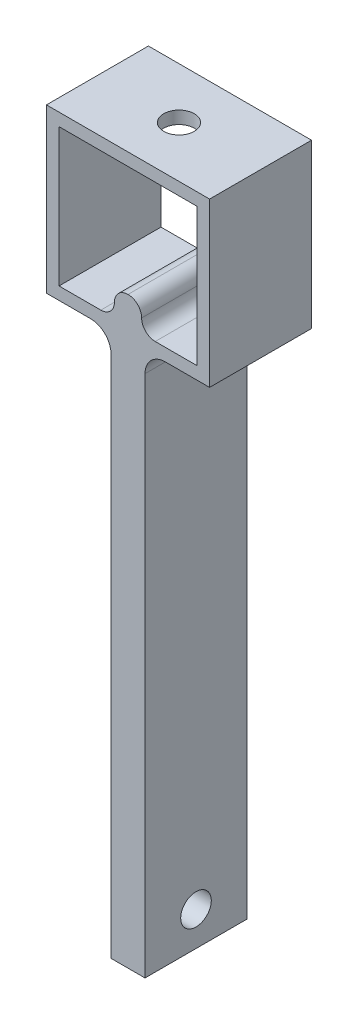
ISO-10303-21;
HEADER;
FILE_DESCRIPTION(('STEP AP214'),'2;1');
FILE_NAME('part.step','',(''),(''),'','','');
FILE_SCHEMA(('AUTOMOTIVE_DESIGN { 1 0 10303 214 1 1 1 1 }'));
ENDSEC;
DATA;
#1=APPLICATION_CONTEXT('core data for automotive mechanical design processes');
#2=APPLICATION_PROTOCOL_DEFINITION('international standard','automotive_design',2000,#1);
#3=PRODUCT_CONTEXT('',#1,'mechanical');
#4=PRODUCT('Part','Part','',(#3));
#5=PRODUCT_RELATED_PRODUCT_CATEGORY('part','',(#4));
#6=PRODUCT_DEFINITION_FORMATION('','',#4);
#7=PRODUCT_DEFINITION_CONTEXT('part definition',#1,'design');
#8=PRODUCT_DEFINITION('design','',#6,#7);
#9=PRODUCT_DEFINITION_SHAPE('','',#8);
#10=(LENGTH_UNIT() NAMED_UNIT(*) SI_UNIT(.MILLI.,.METRE.));
#11=(NAMED_UNIT(*) PLANE_ANGLE_UNIT() SI_UNIT($,.RADIAN.));
#12=(NAMED_UNIT(*) SI_UNIT($,.STERADIAN.) SOLID_ANGLE_UNIT());
#13=UNCERTAINTY_MEASURE_WITH_UNIT(LENGTH_MEASURE(1.E-05),#10,'distance_accuracy_value','');
#14=(GEOMETRIC_REPRESENTATION_CONTEXT(3) GLOBAL_UNCERTAINTY_ASSIGNED_CONTEXT((#13)) GLOBAL_UNIT_ASSIGNED_CONTEXT((#10,
#11,#12)) REPRESENTATION_CONTEXT('',''));
#15=CARTESIAN_POINT('',(0.,0.,0.));
#16=DIRECTION('',(0.,0.,1.));
#17=DIRECTION('',(1.,0.,0.));
#18=AXIS2_PLACEMENT_3D('',#15,#16,#17);
#19=CARTESIAN_POINT('',(10.15,-10.15,20.));
#20=DIRECTION('',(0.,-1.,0.));
#21=DIRECTION('',(0.,0.,-1.));
#22=AXIS2_PLACEMENT_3D('',#19,#20,#21);
#23=PLANE('',#22);
#24=DIRECTION('',(-1.,0.,0.));
#25=VECTOR('',#24,1.);
#26=CARTESIAN_POINT('',(10.15,-10.15,0.));
#27=LINE('',#26,#25);
#28=CARTESIAN_POINT('',(10.15,-10.15,0.));
#29=VERTEX_POINT('',#28);
#30=CARTESIAN_POINT('',(4.,-10.15,0.));
#31=VERTEX_POINT('',#30);
#32=EDGE_CURVE('E208',#29,#31,#27,.T.);
#33=ORIENTED_EDGE('',*,*,#32,.T.);
#34=DIRECTION('',(0.,0.,1.));
#35=VECTOR('',#34,1.);
#36=CARTESIAN_POINT('',(4.,-10.15,20.));
#37=LINE('',#36,#35);
#38=CARTESIAN_POINT('',(4.,-10.15,15.));
#39=VERTEX_POINT('',#38);
#40=EDGE_CURVE('E269',#31,#39,#37,.T.);
#41=ORIENTED_EDGE('',*,*,#40,.T.);
#42=DIRECTION('',(-1.,0.,0.));
#43=VECTOR('',#42,1.);
#44=CARTESIAN_POINT('',(0.,-10.15,15.));
#45=LINE('',#44,#43);
#46=CARTESIAN_POINT('',(10.15,-10.15,15.));
#47=VERTEX_POINT('',#46);
#48=EDGE_CURVE('E228',#47,#39,#45,.T.);
#49=ORIENTED_EDGE('',*,*,#48,.F.);
#50=DIRECTION('',(0.,0.,-1.));
#51=VECTOR('',#50,1.);
#52=CARTESIAN_POINT('',(10.15,-10.15,20.));
#53=LINE('',#52,#51);
#54=EDGE_CURVE('E216',#47,#29,#53,.T.);
#55=ORIENTED_EDGE('',*,*,#54,.T.);
#56=EDGE_LOOP('',(#33,#41,#49,#55));
#57=FACE_BOUND('',#56,.T.);
#58=ADVANCED_FACE('F33',(#57),#23,.F.);
#59=CARTESIAN_POINT('',(-12.,-12.,15.));
#60=DIRECTION('',(0.,1.,0.));
#61=DIRECTION('',(0.,0.,1.));
#62=AXIS2_PLACEMENT_3D('',#59,#60,#61);
#63=PLANE('',#62);
#64=DIRECTION('',(1.,0.,0.));
#65=VECTOR('',#64,1.);
#66=CARTESIAN_POINT('',(-12.,-12.,0.));
#67=LINE('',#66,#65);
#68=CARTESIAN_POINT('',(-12.,-12.,0.));
#69=VERTEX_POINT('',#68);
#70=CARTESIAN_POINT('',(-5.5,-12.,0.));
#71=VERTEX_POINT('',#70);
#72=EDGE_CURVE('E239',#69,#71,#67,.T.);
#73=ORIENTED_EDGE('',*,*,#72,.T.);
#74=DIRECTION('',(0.,0.,-1.));
#75=VECTOR('',#74,1.);
#76=CARTESIAN_POINT('',(-5.5,-12.,15.));
#77=LINE('',#76,#75);
#78=CARTESIAN_POINT('',(-5.5,-12.,15.));
#79=VERTEX_POINT('',#78);
#80=EDGE_CURVE('E54',#71,#79,#77,.F.);
#81=ORIENTED_EDGE('',*,*,#80,.T.);
#82=DIRECTION('',(1.,0.,0.));
#83=VECTOR('',#82,1.);
#84=CARTESIAN_POINT('',(-12.,-12.,15.));
#85=LINE('',#84,#83);
#86=CARTESIAN_POINT('',(-12.,-12.,15.));
#87=VERTEX_POINT('',#86);
#88=EDGE_CURVE('E244',#87,#79,#85,.T.);
#89=ORIENTED_EDGE('',*,*,#88,.F.);
#90=DIRECTION('',(0.,0.,-1.));
#91=VECTOR('',#90,1.);
#92=CARTESIAN_POINT('',(-12.,-12.,15.));
#93=LINE('',#92,#91);
#94=EDGE_CURVE('E257',#87,#69,#93,.T.);
#95=ORIENTED_EDGE('',*,*,#94,.T.);
#96=EDGE_LOOP('',(#73,#81,#89,#95));
#97=FACE_BOUND('',#96,.T.);
#98=ADVANCED_FACE('F334',(#97),#63,.F.);
#99=CARTESIAN_POINT('',(5.5,-12.,15.));
#100=VERTEX_POINT('',#99);
#101=CARTESIAN_POINT('',(12.,-12.,15.));
#102=VERTEX_POINT('',#101);
#103=EDGE_CURVE('E243',#100,#102,#85,.T.);
#104=ORIENTED_EDGE('',*,*,#103,.F.);
#105=DIRECTION('',(0.,0.,1.));
#106=VECTOR('',#105,1.);
#107=CARTESIAN_POINT('',(5.5,-12.,0.));
#108=LINE('',#107,#106);
#109=CARTESIAN_POINT('',(5.5,-12.,0.));
#110=VERTEX_POINT('',#109);
#111=EDGE_CURVE('E299',#100,#110,#108,.F.);
#112=ORIENTED_EDGE('',*,*,#111,.T.);
#113=CARTESIAN_POINT('',(12.,-12.,0.));
#114=VERTEX_POINT('',#113);
#115=EDGE_CURVE('E253',#110,#114,#67,.T.);
#116=ORIENTED_EDGE('',*,*,#115,.T.);
#117=DIRECTION('',(0.,0.,-1.));
#118=VECTOR('',#117,1.);
#119=CARTESIAN_POINT('',(12.,-12.,15.));
#120=LINE('',#119,#118);
#121=EDGE_CURVE('E246',#102,#114,#120,.T.);
#122=ORIENTED_EDGE('',*,*,#121,.F.);
#123=EDGE_LOOP('',(#104,#112,#116,#122));
#124=FACE_BOUND('',#123,.T.);
#125=ADVANCED_FACE('F321',(#124),#63,.F.);
#126=CARTESIAN_POINT('',(12.,-12.,15.));
#127=DIRECTION('',(-1.,0.,0.));
#128=DIRECTION('',(0.,0.,1.));
#129=AXIS2_PLACEMENT_3D('',#126,#127,#128);
#130=PLANE('',#129);
#131=DIRECTION('',(0.,1.,0.));
#132=VECTOR('',#131,1.);
#133=CARTESIAN_POINT('',(12.,-12.,0.));
#134=LINE('',#133,#132);
#135=CARTESIAN_POINT('',(12.,12.,0.));
#136=VERTEX_POINT('',#135);
#137=EDGE_CURVE('E234',#114,#136,#134,.T.);
#138=ORIENTED_EDGE('',*,*,#137,.T.);
#139=DIRECTION('',(0.,0.,-1.));
#140=VECTOR('',#139,1.);
#141=CARTESIAN_POINT('',(12.,12.,15.));
#142=LINE('',#141,#140);
#143=CARTESIAN_POINT('',(12.,12.,15.));
#144=VERTEX_POINT('',#143);
#145=EDGE_CURVE('E263',#144,#136,#142,.T.);
#146=ORIENTED_EDGE('',*,*,#145,.F.);
#147=DIRECTION('',(0.,1.,0.));
#148=VECTOR('',#147,1.);
#149=CARTESIAN_POINT('',(12.,-12.,15.));
#150=LINE('',#149,#148);
#151=EDGE_CURVE('E235',#102,#144,#150,.T.);
#152=ORIENTED_EDGE('',*,*,#151,.F.);
#153=ORIENTED_EDGE('',*,*,#121,.T.);
#154=EDGE_LOOP('',(#138,#146,#152,#153));
#155=FACE_BOUND('',#154,.T.);
#156=ADVANCED_FACE('F325',(#155),#130,.F.);
#157=CARTESIAN_POINT('',(-12.,12.,15.));
#158=DIRECTION('',(0.,-1.,0.));
#159=DIRECTION('',(0.,0.,-1.));
#160=AXIS2_PLACEMENT_3D('',#157,#158,#159);
#161=PLANE('',#160);
#162=CARTESIAN_POINT('',(0.,12.,7.5));
#163=DIRECTION('',(0.,1.,0.));
#164=DIRECTION('',(0.,0.,1.));
#165=AXIS2_PLACEMENT_3D('',#162,#163,#164);
#166=CIRCLE('',#165,2.25);
#167=CARTESIAN_POINT('',(0.,12.,9.75));
#168=VERTEX_POINT('',#167);
#169=EDGE_CURVE('E191',#168,#168,#166,.T.);
#170=ORIENTED_EDGE('',*,*,#169,.F.);
#171=EDGE_LOOP('',(#170));
#172=FACE_BOUND('',#171,.T.);
#173=DIRECTION('',(-1.,0.,0.));
#174=VECTOR('',#173,1.);
#175=CARTESIAN_POINT('',(-12.,12.,0.));
#176=LINE('',#175,#174);
#177=CARTESIAN_POINT('',(-12.,12.,0.));
#178=VERTEX_POINT('',#177);
#179=EDGE_CURVE('E249',#136,#178,#176,.T.);
#180=ORIENTED_EDGE('',*,*,#179,.T.);
#181=DIRECTION('',(0.,0.,-1.));
#182=VECTOR('',#181,1.);
#183=CARTESIAN_POINT('',(-12.,12.,15.));
#184=LINE('',#183,#182);
#185=CARTESIAN_POINT('',(-12.,12.,15.));
#186=VERTEX_POINT('',#185);
#187=EDGE_CURVE('E260',#186,#178,#184,.T.);
#188=ORIENTED_EDGE('',*,*,#187,.F.);
#189=DIRECTION('',(-1.,0.,0.));
#190=VECTOR('',#189,1.);
#191=CARTESIAN_POINT('',(-12.,12.,15.));
#192=LINE('',#191,#190);
#193=EDGE_CURVE('E238',#144,#186,#192,.T.);
#194=ORIENTED_EDGE('',*,*,#193,.F.);
#195=ORIENTED_EDGE('',*,*,#145,.T.);
#196=EDGE_LOOP('',(#180,#188,#194,#195));
#197=FACE_BOUND('',#196,.T.);
#198=ADVANCED_FACE('F330',(#172,#197),#161,.F.);
#199=CARTESIAN_POINT('',(-12.,-12.,15.));
#200=DIRECTION('',(1.,0.,0.));
#201=DIRECTION('',(0.,0.,-1.));
#202=AXIS2_PLACEMENT_3D('',#199,#200,#201);
#203=PLANE('',#202);
#204=DIRECTION('',(0.,-1.,0.));
#205=VECTOR('',#204,1.);
#206=CARTESIAN_POINT('',(-12.,-12.,0.));
#207=LINE('',#206,#205);
#208=EDGE_CURVE('E251',#178,#69,#207,.T.);
#209=ORIENTED_EDGE('',*,*,#208,.T.);
#210=ORIENTED_EDGE('',*,*,#94,.F.);
#211=DIRECTION('',(0.,-1.,0.));
#212=VECTOR('',#211,1.);
#213=CARTESIAN_POINT('',(-12.,-12.,15.));
#214=LINE('',#213,#212);
#215=EDGE_CURVE('E241',#186,#87,#214,.T.);
#216=ORIENTED_EDGE('',*,*,#215,.F.);
#217=ORIENTED_EDGE('',*,*,#187,.T.);
#218=EDGE_LOOP('',(#209,#210,#216,#217));
#219=FACE_BOUND('',#218,.T.);
#220=ADVANCED_FACE('F333',(#219),#203,.F.);
#221=CARTESIAN_POINT('',(0.,0.,15.));
#222=DIRECTION('',(0.,0.,-1.));
#223=DIRECTION('',(-1.,0.,0.));
#224=AXIS2_PLACEMENT_3D('',#221,#222,#223);
#225=PLANE('',#224);
#226=ORIENTED_EDGE('',*,*,#48,.T.);
#227=CARTESIAN_POINT('',(4.,-8.15,15.));
#228=DIRECTION('',(0.,0.,-1.));
#229=DIRECTION('',(-1.,0.,0.));
#230=AXIS2_PLACEMENT_3D('',#227,#228,#229);
#231=CIRCLE('',#230,2.);
#232=CARTESIAN_POINT('',(2.,-8.15,15.));
#233=VERTEX_POINT('',#232);
#234=EDGE_CURVE('E283',#39,#233,#231,.T.);
#235=ORIENTED_EDGE('',*,*,#234,.T.);
#236=CARTESIAN_POINT('',(0.,-8.15,15.));
#237=DIRECTION('',(0.,0.,-1.));
#238=DIRECTION('',(-1.,0.,0.));
#239=AXIS2_PLACEMENT_3D('',#236,#237,#238);
#240=CIRCLE('',#239,2.);
#241=CARTESIAN_POINT('',(0.,-6.15,15.));
#242=VERTEX_POINT('',#241);
#243=EDGE_CURVE('E273',#233,#242,#240,.F.);
#244=ORIENTED_EDGE('',*,*,#243,.T.);
#245=CARTESIAN_POINT('',(0.,-8.15,15.));
#246=DIRECTION('',(0.,0.,-1.));
#247=DIRECTION('',(-1.,0.,0.));
#248=AXIS2_PLACEMENT_3D('',#245,#246,#247);
#249=CIRCLE('',#248,2.);
#250=CARTESIAN_POINT('',(-2.,-8.15,15.));
#251=VERTEX_POINT('',#250);
#252=EDGE_CURVE('E271',#242,#251,#249,.F.);
#253=ORIENTED_EDGE('',*,*,#252,.T.);
#254=CARTESIAN_POINT('',(-4.,-8.15,15.));
#255=DIRECTION('',(0.,0.,-1.));
#256=DIRECTION('',(-1.,0.,0.));
#257=AXIS2_PLACEMENT_3D('',#254,#255,#256);
#258=CIRCLE('',#257,2.);
#259=CARTESIAN_POINT('',(-4.,-10.15,15.));
#260=VERTEX_POINT('',#259);
#261=EDGE_CURVE('E279',#251,#260,#258,.T.);
#262=ORIENTED_EDGE('',*,*,#261,.T.);
#263=CARTESIAN_POINT('',(-10.15,-10.15,15.));
#264=VERTEX_POINT('',#263);
#265=EDGE_CURVE('E227',#260,#264,#45,.T.);
#266=ORIENTED_EDGE('',*,*,#265,.T.);
#267=DIRECTION('',(0.,1.,0.));
#268=VECTOR('',#267,1.);
#269=CARTESIAN_POINT('',(-10.15,0.,15.));
#270=LINE('',#269,#268);
#271=CARTESIAN_POINT('',(-10.15,10.15,15.));
#272=VERTEX_POINT('',#271);
#273=EDGE_CURVE('E231',#264,#272,#270,.T.);
#274=ORIENTED_EDGE('',*,*,#273,.T.);
#275=DIRECTION('',(1.,0.,0.));
#276=VECTOR('',#275,1.);
#277=CARTESIAN_POINT('',(0.,10.15,15.));
#278=LINE('',#277,#276);
#279=CARTESIAN_POINT('',(10.15,10.15,15.));
#280=VERTEX_POINT('',#279);
#281=EDGE_CURVE('E215',#272,#280,#278,.T.);
#282=ORIENTED_EDGE('',*,*,#281,.T.);
#283=DIRECTION('',(0.,-1.,0.));
#284=VECTOR('',#283,1.);
#285=CARTESIAN_POINT('',(10.15,0.,15.));
#286=LINE('',#285,#284);
#287=EDGE_CURVE('E224',#280,#47,#286,.T.);
#288=ORIENTED_EDGE('',*,*,#287,.T.);
#289=EDGE_LOOP('',(#226,#235,#244,#253,#262,#266,#274,#282,#288));
#290=FACE_BOUND('',#289,.T.);
#291=ORIENTED_EDGE('',*,*,#151,.T.);
#292=ORIENTED_EDGE('',*,*,#193,.T.);
#293=ORIENTED_EDGE('',*,*,#215,.T.);
#294=ORIENTED_EDGE('',*,*,#88,.T.);
#295=CARTESIAN_POINT('',(-5.5,-15.,15.));
#296=DIRECTION('',(0.,0.,-1.));
#297=DIRECTION('',(-1.,0.,0.));
#298=AXIS2_PLACEMENT_3D('',#295,#296,#297);
#299=CIRCLE('',#298,3.);
#300=CARTESIAN_POINT('',(-2.5,-15.,15.));
#301=VERTEX_POINT('',#300);
#302=EDGE_CURVE('E11',#79,#301,#299,.T.);
#303=ORIENTED_EDGE('',*,*,#302,.T.);
#304=DIRECTION('',(0.,1.,0.));
#305=VECTOR('',#304,1.);
#306=CARTESIAN_POINT('',(-2.5,-92.,15.));
#307=LINE('',#306,#305);
#308=CARTESIAN_POINT('',(-2.5,-92.,15.));
#309=VERTEX_POINT('',#308);
#310=EDGE_CURVE('E451',#309,#301,#307,.T.);
#311=ORIENTED_EDGE('',*,*,#310,.F.);
#312=DIRECTION('',(-1.,0.,0.));
#313=VECTOR('',#312,1.);
#314=CARTESIAN_POINT('',(2.5,-92.,15.));
#315=LINE('',#314,#313);
#316=CARTESIAN_POINT('',(2.5,-92.,15.));
#317=VERTEX_POINT('',#316);
#318=EDGE_CURVE('E178',#317,#309,#315,.T.);
#319=ORIENTED_EDGE('',*,*,#318,.F.);
#320=DIRECTION('',(0.,1.,0.));
#321=VECTOR('',#320,1.);
#322=CARTESIAN_POINT('',(2.5,-92.,15.));
#323=LINE('',#322,#321);
#324=CARTESIAN_POINT('',(2.5,-15.,15.));
#325=VERTEX_POINT('',#324);
#326=EDGE_CURVE('E193',#317,#325,#323,.T.);
#327=ORIENTED_EDGE('',*,*,#326,.T.);
#328=CARTESIAN_POINT('',(5.5,-15.,15.));
#329=DIRECTION('',(0.,0.,-1.));
#330=DIRECTION('',(-1.,0.,0.));
#331=AXIS2_PLACEMENT_3D('',#328,#329,#330);
#332=CIRCLE('',#331,3.);
#333=EDGE_CURVE('E303',#325,#100,#332,.T.);
#334=ORIENTED_EDGE('',*,*,#333,.T.);
#335=ORIENTED_EDGE('',*,*,#103,.T.);
#336=EDGE_LOOP('',(#291,#292,#293,#294,#303,#311,#319,#327,#334,#335));
#337=FACE_BOUND('',#336,.T.);
#338=ADVANCED_FACE('F318',(#290,#337),#225,.F.);
#339=CARTESIAN_POINT('',(0.,0.,0.));
#340=DIRECTION('',(0.,0.,-1.));
#341=DIRECTION('',(-1.,0.,0.));
#342=AXIS2_PLACEMENT_3D('',#339,#340,#341);
#343=PLANE('',#342);
#344=CARTESIAN_POINT('',(0.,-8.15,0.));
#345=DIRECTION('',(0.,0.,-1.));
#346=DIRECTION('',(-1.,0.,0.));
#347=AXIS2_PLACEMENT_3D('',#344,#345,#346);
#348=CIRCLE('',#347,2.);
#349=CARTESIAN_POINT('',(-2.,-8.15,0.));
#350=VERTEX_POINT('',#349);
#351=CARTESIAN_POINT('',(0.,-6.15,0.));
#352=VERTEX_POINT('',#351);
#353=EDGE_CURVE('E275',#350,#352,#348,.T.);
#354=ORIENTED_EDGE('',*,*,#353,.T.);
#355=CARTESIAN_POINT('',(0.,-8.15,0.));
#356=DIRECTION('',(0.,0.,-1.));
#357=DIRECTION('',(-1.,0.,0.));
#358=AXIS2_PLACEMENT_3D('',#355,#356,#357);
#359=CIRCLE('',#358,2.);
#360=CARTESIAN_POINT('',(2.,-8.15,0.));
#361=VERTEX_POINT('',#360);
#362=EDGE_CURVE('E277',#352,#361,#359,.T.);
#363=ORIENTED_EDGE('',*,*,#362,.T.);
#364=CARTESIAN_POINT('',(4.,-8.15,0.));
#365=DIRECTION('',(0.,0.,-1.));
#366=DIRECTION('',(-1.,0.,0.));
#367=AXIS2_PLACEMENT_3D('',#364,#365,#366);
#368=CIRCLE('',#367,2.);
#369=EDGE_CURVE('E285',#361,#31,#368,.F.);
#370=ORIENTED_EDGE('',*,*,#369,.T.);
#371=ORIENTED_EDGE('',*,*,#32,.F.);
#372=DIRECTION('',(0.,-1.,0.));
#373=VECTOR('',#372,1.);
#374=CARTESIAN_POINT('',(10.15,-10.15,0.));
#375=LINE('',#374,#373);
#376=CARTESIAN_POINT('',(10.15,10.15,0.));
#377=VERTEX_POINT('',#376);
#378=EDGE_CURVE('E204',#377,#29,#375,.T.);
#379=ORIENTED_EDGE('',*,*,#378,.F.);
#380=DIRECTION('',(1.,0.,0.));
#381=VECTOR('',#380,1.);
#382=CARTESIAN_POINT('',(10.15,10.15,0.));
#383=LINE('',#382,#381);
#384=CARTESIAN_POINT('',(-10.15,10.15,0.));
#385=VERTEX_POINT('',#384);
#386=EDGE_CURVE('E201',#385,#377,#383,.T.);
#387=ORIENTED_EDGE('',*,*,#386,.F.);
#388=DIRECTION('',(0.,1.,0.));
#389=VECTOR('',#388,1.);
#390=CARTESIAN_POINT('',(-10.15,-10.15,0.));
#391=LINE('',#390,#389);
#392=CARTESIAN_POINT('',(-10.15,-10.15,0.));
#393=VERTEX_POINT('',#392);
#394=EDGE_CURVE('E199',#393,#385,#391,.T.);
#395=ORIENTED_EDGE('',*,*,#394,.F.);
#396=CARTESIAN_POINT('',(-4.,-10.15,0.));
#397=VERTEX_POINT('',#396);
#398=EDGE_CURVE('E207',#397,#393,#27,.T.);
#399=ORIENTED_EDGE('',*,*,#398,.F.);
#400=CARTESIAN_POINT('',(-4.,-8.15,0.));
#401=DIRECTION('',(0.,0.,-1.));
#402=DIRECTION('',(-1.,0.,0.));
#403=AXIS2_PLACEMENT_3D('',#400,#401,#402);
#404=CIRCLE('',#403,2.);
#405=EDGE_CURVE('E281',#397,#350,#404,.F.);
#406=ORIENTED_EDGE('',*,*,#405,.T.);
#407=EDGE_LOOP('',(#354,#363,#370,#371,#379,#387,#395,#399,#406));
#408=FACE_BOUND('',#407,.T.);
#409=ORIENTED_EDGE('',*,*,#137,.F.);
#410=ORIENTED_EDGE('',*,*,#115,.F.);
#411=CARTESIAN_POINT('',(5.5,-15.,0.));
#412=DIRECTION('',(0.,0.,-1.));
#413=DIRECTION('',(-1.,0.,0.));
#414=AXIS2_PLACEMENT_3D('',#411,#412,#413);
#415=CIRCLE('',#414,3.);
#416=CARTESIAN_POINT('',(2.5,-15.,0.));
#417=VERTEX_POINT('',#416);
#418=EDGE_CURVE('E305',#110,#417,#415,.F.);
#419=ORIENTED_EDGE('',*,*,#418,.T.);
#420=DIRECTION('',(0.,1.,0.));
#421=VECTOR('',#420,1.);
#422=CARTESIAN_POINT('',(2.5,-92.,0.));
#423=LINE('',#422,#421);
#424=CARTESIAN_POINT('',(2.5,-92.,0.));
#425=VERTEX_POINT('',#424);
#426=EDGE_CURVE('E169',#425,#417,#423,.T.);
#427=ORIENTED_EDGE('',*,*,#426,.F.);
#428=DIRECTION('',(1.,0.,0.));
#429=VECTOR('',#428,1.);
#430=CARTESIAN_POINT('',(2.5,-92.,0.));
#431=LINE('',#430,#429);
#432=CARTESIAN_POINT('',(-2.5,-92.,0.));
#433=VERTEX_POINT('',#432);
#434=EDGE_CURVE('E162',#433,#425,#431,.T.);
#435=ORIENTED_EDGE('',*,*,#434,.F.);
#436=DIRECTION('',(0.,1.,0.));
#437=VECTOR('',#436,1.);
#438=CARTESIAN_POINT('',(-2.5,-92.,0.));
#439=LINE('',#438,#437);
#440=CARTESIAN_POINT('',(-2.5,-15.,0.));
#441=VERTEX_POINT('',#440);
#442=EDGE_CURVE('E167',#433,#441,#439,.T.);
#443=ORIENTED_EDGE('',*,*,#442,.T.);
#444=CARTESIAN_POINT('',(-5.5,-15.,0.));
#445=DIRECTION('',(0.,0.,-1.));
#446=DIRECTION('',(-1.,0.,0.));
#447=AXIS2_PLACEMENT_3D('',#444,#445,#446);
#448=CIRCLE('',#447,3.);
#449=EDGE_CURVE('E41',#441,#71,#448,.F.);
#450=ORIENTED_EDGE('',*,*,#449,.T.);
#451=ORIENTED_EDGE('',*,*,#72,.F.);
#452=ORIENTED_EDGE('',*,*,#208,.F.);
#453=ORIENTED_EDGE('',*,*,#179,.F.);
#454=EDGE_LOOP('',(#409,#410,#419,#427,#435,#443,#450,#451,#452,#453));
#455=FACE_BOUND('',#454,.T.);
#456=ADVANCED_FACE('F165',(#408,#455),#343,.T.);
#457=CARTESIAN_POINT('',(-10.15,-10.15,20.));
#458=DIRECTION('',(-1.,0.,0.));
#459=DIRECTION('',(0.,0.,1.));
#460=AXIS2_PLACEMENT_3D('',#457,#458,#459);
#461=PLANE('',#460);
#462=DIRECTION('',(0.,0.,-1.));
#463=VECTOR('',#462,1.);
#464=CARTESIAN_POINT('',(-10.15,-10.15,20.));
#465=LINE('',#464,#463);
#466=EDGE_CURVE('E212',#264,#393,#465,.T.);
#467=ORIENTED_EDGE('',*,*,#466,.T.);
#468=ORIENTED_EDGE('',*,*,#394,.T.);
#469=DIRECTION('',(0.,0.,-1.));
#470=VECTOR('',#469,1.);
#471=CARTESIAN_POINT('',(-10.15,10.15,20.));
#472=LINE('',#471,#470);
#473=EDGE_CURVE('E211',#272,#385,#472,.T.);
#474=ORIENTED_EDGE('',*,*,#473,.F.);
#475=ORIENTED_EDGE('',*,*,#273,.F.);
#476=EDGE_LOOP('',(#467,#468,#474,#475));
#477=FACE_BOUND('',#476,.T.);
#478=ADVANCED_FACE('F354',(#477),#461,.F.);
#479=ORIENTED_EDGE('',*,*,#265,.F.);
#480=DIRECTION('',(0.,0.,1.));
#481=VECTOR('',#480,1.);
#482=CARTESIAN_POINT('',(-4.,-10.15,20.));
#483=LINE('',#482,#481);
#484=EDGE_CURVE('E266',#260,#397,#483,.F.);
#485=ORIENTED_EDGE('',*,*,#484,.T.);
#486=ORIENTED_EDGE('',*,*,#398,.T.);
#487=ORIENTED_EDGE('',*,*,#466,.F.);
#488=EDGE_LOOP('',(#479,#485,#486,#487));
#489=FACE_BOUND('',#488,.T.);
#490=ADVANCED_FACE('F345',(#489),#23,.F.);
#491=CARTESIAN_POINT('',(10.15,-10.15,20.));
#492=DIRECTION('',(1.,0.,0.));
#493=DIRECTION('',(0.,0.,-1.));
#494=AXIS2_PLACEMENT_3D('',#491,#492,#493);
#495=PLANE('',#494);
#496=DIRECTION('',(0.,0.,-1.));
#497=VECTOR('',#496,1.);
#498=CARTESIAN_POINT('',(10.15,10.15,20.));
#499=LINE('',#498,#497);
#500=EDGE_CURVE('E218',#280,#377,#499,.T.);
#501=ORIENTED_EDGE('',*,*,#500,.T.);
#502=ORIENTED_EDGE('',*,*,#378,.T.);
#503=ORIENTED_EDGE('',*,*,#54,.F.);
#504=ORIENTED_EDGE('',*,*,#287,.F.);
#505=EDGE_LOOP('',(#501,#502,#503,#504));
#506=FACE_BOUND('',#505,.T.);
#507=ADVANCED_FACE('F353',(#506),#495,.F.);
#508=CARTESIAN_POINT('',(10.15,10.15,20.));
#509=DIRECTION('',(0.,1.,0.));
#510=DIRECTION('',(0.,0.,1.));
#511=AXIS2_PLACEMENT_3D('',#508,#509,#510);
#512=PLANE('',#511);
#513=CARTESIAN_POINT('',(0.,10.15,7.5));
#514=DIRECTION('',(0.,1.,0.));
#515=DIRECTION('',(0.,0.,1.));
#516=AXIS2_PLACEMENT_3D('',#513,#514,#515);
#517=CIRCLE('',#516,2.25);
#518=CARTESIAN_POINT('',(0.,10.15,9.75));
#519=VERTEX_POINT('',#518);
#520=EDGE_CURVE('E188',#519,#519,#517,.F.);
#521=ORIENTED_EDGE('',*,*,#520,.F.);
#522=EDGE_LOOP('',(#521));
#523=FACE_BOUND('',#522,.T.);
#524=ORIENTED_EDGE('',*,*,#473,.T.);
#525=ORIENTED_EDGE('',*,*,#386,.T.);
#526=ORIENTED_EDGE('',*,*,#500,.F.);
#527=ORIENTED_EDGE('',*,*,#281,.F.);
#528=EDGE_LOOP('',(#524,#525,#526,#527));
#529=FACE_BOUND('',#528,.T.);
#530=ADVANCED_FACE('F360',(#523,#529),#512,.F.);
#531=CARTESIAN_POINT('',(0.,-12.001,7.5));
#532=DIRECTION('',(0.,1.,0.));
#533=DIRECTION('',(0.,0.,1.));
#534=AXIS2_PLACEMENT_3D('',#531,#532,#533);
#535=CYLINDRICAL_SURFACE('',#534,2.25);
#536=CARTESIAN_POINT('',(0.,12.,9.75));
#537=CARTESIAN_POINT('',(0.,11.9807291666667,9.75));
#538=CARTESIAN_POINT('',(0.,11.9614583333333,9.75));
#539=CARTESIAN_POINT('',(0.,11.9229166666667,9.75));
#540=CARTESIAN_POINT('',(0.,11.9036458333333,9.75));
#541=CARTESIAN_POINT('',(0.,11.8651041666667,9.75));
#542=CARTESIAN_POINT('',(0.,11.8458333333333,9.75));
#543=CARTESIAN_POINT('',(0.,11.8072916666667,9.75));
#544=CARTESIAN_POINT('',(0.,11.7880208333333,9.75));
#545=CARTESIAN_POINT('',(0.,11.7494791666667,9.75));
#546=CARTESIAN_POINT('',(0.,11.7302083333333,9.75));
#547=CARTESIAN_POINT('',(0.,11.6916666666667,9.75));
#548=CARTESIAN_POINT('',(0.,11.6723958333333,9.75));
#549=CARTESIAN_POINT('',(0.,11.6338541666667,9.75));
#550=CARTESIAN_POINT('',(0.,11.6145833333333,9.75));
#551=CARTESIAN_POINT('',(0.,11.5760416666667,9.75));
#552=CARTESIAN_POINT('',(0.,11.5567708333333,9.75));
#553=CARTESIAN_POINT('',(0.,11.5182291666667,9.75));
#554=CARTESIAN_POINT('',(0.,11.4989583333333,9.75));
#555=CARTESIAN_POINT('',(0.,11.4604166666667,9.75));
#556=CARTESIAN_POINT('',(0.,11.4411458333333,9.75));
#557=CARTESIAN_POINT('',(0.,11.4026041666667,9.75));
#558=CARTESIAN_POINT('',(0.,11.3833333333333,9.75));
#559=CARTESIAN_POINT('',(0.,11.3447916666667,9.75));
#560=CARTESIAN_POINT('',(0.,11.3255208333333,9.75));
#561=CARTESIAN_POINT('',(0.,11.2869791666667,9.75));
#562=CARTESIAN_POINT('',(0.,11.2677083333333,9.75));
#563=CARTESIAN_POINT('',(0.,11.2291666666667,9.75));
#564=CARTESIAN_POINT('',(0.,11.2098958333333,9.75));
#565=CARTESIAN_POINT('',(0.,11.1713541666667,9.75));
#566=CARTESIAN_POINT('',(0.,11.1520833333333,9.75));
#567=CARTESIAN_POINT('',(0.,11.1135416666667,9.75));
#568=CARTESIAN_POINT('',(0.,11.0942708333333,9.75));
#569=CARTESIAN_POINT('',(0.,11.0557291666667,9.75));
#570=CARTESIAN_POINT('',(0.,11.0364583333333,9.75));
#571=CARTESIAN_POINT('',(0.,10.9979166666667,9.75));
#572=CARTESIAN_POINT('',(0.,10.9786458333333,9.75));
#573=CARTESIAN_POINT('',(0.,10.9401041666667,9.75));
#574=CARTESIAN_POINT('',(0.,10.9208333333333,9.75));
#575=CARTESIAN_POINT('',(0.,10.8822916666667,9.75));
#576=CARTESIAN_POINT('',(0.,10.8630208333333,9.75));
#577=CARTESIAN_POINT('',(0.,10.8244791666667,9.75));
#578=CARTESIAN_POINT('',(0.,10.8052083333333,9.75));
#579=CARTESIAN_POINT('',(0.,10.7666666666667,9.75));
#580=CARTESIAN_POINT('',(0.,10.7473958333333,9.75));
#581=CARTESIAN_POINT('',(0.,10.7088541666667,9.75));
#582=CARTESIAN_POINT('',(0.,10.6895833333333,9.75));
#583=CARTESIAN_POINT('',(0.,10.6510416666667,9.75));
#584=CARTESIAN_POINT('',(0.,10.6317708333333,9.75));
#585=CARTESIAN_POINT('',(0.,10.5932291666667,9.75));
#586=CARTESIAN_POINT('',(0.,10.5739583333333,9.75));
#587=CARTESIAN_POINT('',(0.,10.5354166666667,9.75));
#588=CARTESIAN_POINT('',(0.,10.5161458333333,9.75));
#589=CARTESIAN_POINT('',(0.,10.4776041666667,9.75));
#590=CARTESIAN_POINT('',(0.,10.4583333333333,9.75));
#591=CARTESIAN_POINT('',(0.,10.4197916666667,9.75));
#592=CARTESIAN_POINT('',(0.,10.4005208333333,9.75));
#593=CARTESIAN_POINT('',(0.,10.3619791666667,9.75));
#594=CARTESIAN_POINT('',(0.,10.3427083333333,9.75));
#595=CARTESIAN_POINT('',(0.,10.3041666666667,9.75));
#596=CARTESIAN_POINT('',(0.,10.2848958333333,9.75));
#597=CARTESIAN_POINT('',(0.,10.2463541666667,9.75));
#598=CARTESIAN_POINT('',(0.,10.2270833333333,9.75));
#599=CARTESIAN_POINT('',(0.,10.1885416666667,9.75));
#600=CARTESIAN_POINT('',(0.,10.1692708333333,9.75));
#601=CARTESIAN_POINT('',(0.,10.15,9.75));
#602=B_SPLINE_CURVE_WITH_KNOTS('',3,(#536,#537,#538,#539,#540,#541,#542,#543,#544,#545,#546,
#547,#548,#549,#550,#551,#552,#553,#554,#555,#556,#557,#558,#559,#560,#561,#562,#563,#564,#565,
#566,#567,#568,#569,#570,#571,#572,#573,#574,#575,#576,#577,#578,#579,#580,#581,#582,#583,#584,
#585,#586,#587,#588,#589,#590,#591,#592,#593,#594,#595,#596,#597,#598,#599,#600,#601),
.UNSPECIFIED.,.F.,.F.,(4,2,2,2,2,2,2,2,2,2,2,2,2,2,2,2,2,2,2,2,2,2,2,2,2,2,2,2,2,2,2,2,4),(0.,
0.0578125000000006,0.115625000000001,0.173437499999998,0.231249999999999,0.289062499999999,
0.346875,0.404687500000001,0.462499999999998,0.520312499999998,0.578124999999999,
0.635937499999999,0.69375,0.7515625,0.809374999999998,0.867187499999998,0.924999999999999,
0.982812499999999,1.040625,1.0984375,1.15625,1.2140625,1.271875,1.3296875,1.3875,1.4453125,
1.503125,1.5609375,1.61875,1.6765625,1.734375,1.7921875,1.85),.UNSPECIFIED.);
#603=EDGE_CURVE('BSEAM399',#168,#519,#602,.T.);
#604=ORIENTED_EDGE('',*,*,#169,.T.);
#605=ORIENTED_EDGE('',*,*,#520,.T.);
#606=ORIENTED_EDGE('',*,*,#603,.T.);
#607=ORIENTED_EDGE('',*,*,#603,.F.);
#608=EDGE_LOOP('',(#604,#606,#605,#607));
#609=FACE_BOUND('',#608,.T.);
#610=ADVANCED_FACE('F399',(#609),#535,.F.);
#611=CARTESIAN_POINT('',(-2.5,-92.,0.));
#612=DIRECTION('',(1.,0.,0.));
#613=DIRECTION('',(0.,0.,-1.));
#614=AXIS2_PLACEMENT_3D('',#611,#612,#613);
#615=PLANE('',#614);
#616=CARTESIAN_POINT('',(-2.5,-87.,7.49999999999999));
#617=DIRECTION('',(-1.,0.,0.));
#618=DIRECTION('',(0.,0.,1.));
#619=AXIS2_PLACEMENT_3D('',#616,#617,#618);
#620=CIRCLE('',#619,2.25);
#621=CARTESIAN_POINT('',(-2.5,-87.,9.75));
#622=VERTEX_POINT('',#621);
#623=EDGE_CURVE('E443',#622,#622,#620,.T.);
#624=ORIENTED_EDGE('',*,*,#623,.F.);
#625=EDGE_LOOP('',(#624));
#626=FACE_BOUND('',#625,.T.);
#627=ORIENTED_EDGE('',*,*,#310,.T.);
#628=DIRECTION('',(0.,0.,-1.));
#629=VECTOR('',#628,1.);
#630=CARTESIAN_POINT('',(-2.5,-15.,0.));
#631=LINE('',#630,#629);
#632=EDGE_CURVE('E187',#301,#441,#631,.T.);
#633=ORIENTED_EDGE('',*,*,#632,.T.);
#634=ORIENTED_EDGE('',*,*,#442,.F.);
#635=DIRECTION('',(0.,0.,-1.));
#636=VECTOR('',#635,1.);
#637=CARTESIAN_POINT('',(-2.5,-92.,0.));
#638=LINE('',#637,#636);
#639=EDGE_CURVE('E173',#309,#433,#638,.T.);
#640=ORIENTED_EDGE('',*,*,#639,.F.);
#641=EDGE_LOOP('',(#627,#633,#634,#640));
#642=FACE_BOUND('',#641,.T.);
#643=ADVANCED_FACE('F185',(#626,#642),#615,.F.);
#644=CARTESIAN_POINT('',(2.5,-92.,0.));
#645=DIRECTION('',(-1.,0.,0.));
#646=DIRECTION('',(0.,0.,1.));
#647=AXIS2_PLACEMENT_3D('',#644,#645,#646);
#648=PLANE('',#647);
#649=CARTESIAN_POINT('',(2.5,-87.,7.49999999999999));
#650=DIRECTION('',(-1.,0.,0.));
#651=DIRECTION('',(0.,0.,1.));
#652=AXIS2_PLACEMENT_3D('',#649,#650,#651);
#653=CIRCLE('',#652,2.25);
#654=CARTESIAN_POINT('',(2.5,-87.,9.75));
#655=VERTEX_POINT('',#654);
#656=EDGE_CURVE('E292',#655,#655,#653,.F.);
#657=ORIENTED_EDGE('',*,*,#656,.F.);
#658=EDGE_LOOP('',(#657));
#659=FACE_BOUND('',#658,.T.);
#660=ORIENTED_EDGE('',*,*,#426,.T.);
#661=DIRECTION('',(0.,0.,1.));
#662=VECTOR('',#661,1.);
#663=CARTESIAN_POINT('',(2.5,-15.,15.));
#664=LINE('',#663,#662);
#665=EDGE_CURVE('E287',#417,#325,#664,.T.);
#666=ORIENTED_EDGE('',*,*,#665,.T.);
#667=ORIENTED_EDGE('',*,*,#326,.F.);
#668=DIRECTION('',(0.,0.,1.));
#669=VECTOR('',#668,1.);
#670=CARTESIAN_POINT('',(2.5,-92.,0.));
#671=LINE('',#670,#669);
#672=EDGE_CURVE('E172',#425,#317,#671,.T.);
#673=ORIENTED_EDGE('',*,*,#672,.F.);
#674=EDGE_LOOP('',(#660,#666,#667,#673));
#675=FACE_BOUND('',#674,.T.);
#676=ADVANCED_FACE('F312',(#659,#675),#648,.F.);
#677=CARTESIAN_POINT('',(0.,-92.,0.));
#678=DIRECTION('',(0.,-1.,0.));
#679=DIRECTION('',(0.,0.,-1.));
#680=AXIS2_PLACEMENT_3D('',#677,#678,#679);
#681=PLANE('',#680);
#682=ORIENTED_EDGE('',*,*,#639,.T.);
#683=ORIENTED_EDGE('',*,*,#434,.T.);
#684=ORIENTED_EDGE('',*,*,#672,.T.);
#685=ORIENTED_EDGE('',*,*,#318,.T.);
#686=EDGE_LOOP('',(#682,#683,#684,#685));
#687=FACE_BOUND('',#686,.T.);
#688=ADVANCED_FACE('F176',(#687),#681,.T.);
#689=CARTESIAN_POINT('',(4.,-8.15,20.));
#690=DIRECTION('',(0.,0.,1.));
#691=DIRECTION('',(1.,0.,0.));
#692=AXIS2_PLACEMENT_3D('',#689,#690,#691);
#693=CYLINDRICAL_SURFACE('',#692,2.);
#694=ORIENTED_EDGE('',*,*,#40,.F.);
#695=ORIENTED_EDGE('',*,*,#369,.F.);
#696=DIRECTION('',(0.,0.,1.));
#697=VECTOR('',#696,1.);
#698=CARTESIAN_POINT('',(2.,-8.15,0.));
#699=LINE('',#698,#697);
#700=EDGE_CURVE('E182',#233,#361,#699,.F.);
#701=ORIENTED_EDGE('',*,*,#700,.F.);
#702=ORIENTED_EDGE('',*,*,#234,.F.);
#703=EDGE_LOOP('',(#694,#695,#701,#702));
#704=FACE_BOUND('',#703,.T.);
#705=ADVANCED_FACE('F390',(#704),#693,.F.);
#706=CARTESIAN_POINT('',(0.,-8.15,0.));
#707=DIRECTION('',(0.,0.,1.));
#708=DIRECTION('',(1.,0.,0.));
#709=AXIS2_PLACEMENT_3D('',#706,#707,#708);
#710=CYLINDRICAL_SURFACE('',#709,2.);
#711=ORIENTED_EDGE('',*,*,#700,.T.);
#712=ORIENTED_EDGE('',*,*,#362,.F.);
#713=DIRECTION('',(0.,0.,1.));
#714=VECTOR('',#713,1.);
#715=CARTESIAN_POINT('',(0.,-6.15,0.));
#716=LINE('',#715,#714);
#717=EDGE_CURVE('E291',#242,#352,#716,.F.);
#718=ORIENTED_EDGE('',*,*,#717,.F.);
#719=ORIENTED_EDGE('',*,*,#243,.F.);
#720=EDGE_LOOP('',(#711,#712,#718,#719));
#721=FACE_BOUND('',#720,.T.);
#722=ADVANCED_FACE('F384',(#721),#710,.T.);
#723=CARTESIAN_POINT('',(0.,-8.15,0.));
#724=DIRECTION('',(0.,0.,1.));
#725=DIRECTION('',(1.,0.,0.));
#726=AXIS2_PLACEMENT_3D('',#723,#724,#725);
#727=CYLINDRICAL_SURFACE('',#726,2.);
#728=ORIENTED_EDGE('',*,*,#717,.T.);
#729=ORIENTED_EDGE('',*,*,#353,.F.);
#730=DIRECTION('',(0.,0.,1.));
#731=VECTOR('',#730,1.);
#732=CARTESIAN_POINT('',(-2.,-8.15,0.));
#733=LINE('',#732,#731);
#734=EDGE_CURVE('E288',#251,#350,#733,.F.);
#735=ORIENTED_EDGE('',*,*,#734,.F.);
#736=ORIENTED_EDGE('',*,*,#252,.F.);
#737=EDGE_LOOP('',(#728,#729,#735,#736));
#738=FACE_BOUND('',#737,.T.);
#739=ADVANCED_FACE('F379',(#738),#727,.T.);
#740=CARTESIAN_POINT('',(-4.,-8.15,0.));
#741=DIRECTION('',(0.,0.,1.));
#742=DIRECTION('',(1.,0.,0.));
#743=AXIS2_PLACEMENT_3D('',#740,#741,#742);
#744=CYLINDRICAL_SURFACE('',#743,2.);
#745=ORIENTED_EDGE('',*,*,#405,.F.);
#746=ORIENTED_EDGE('',*,*,#484,.F.);
#747=ORIENTED_EDGE('',*,*,#261,.F.);
#748=ORIENTED_EDGE('',*,*,#734,.T.);
#749=EDGE_LOOP('',(#745,#746,#747,#748));
#750=FACE_BOUND('',#749,.T.);
#751=ADVANCED_FACE('F372',(#750),#744,.F.);
#752=CARTESIAN_POINT('',(12.001,-87.,7.49999999999999));
#753=DIRECTION('',(-1.,0.,0.));
#754=DIRECTION('',(0.,0.,1.));
#755=AXIS2_PLACEMENT_3D('',#752,#753,#754);
#756=CYLINDRICAL_SURFACE('',#755,2.25);
#757=ORIENTED_EDGE('',*,*,#623,.T.);
#758=EDGE_LOOP('',(#757));
#759=FACE_BOUND('',#758,.T.);
#760=ORIENTED_EDGE('',*,*,#656,.T.);
#761=EDGE_LOOP('',(#760));
#762=FACE_BOUND('',#761,.T.);
#763=ADVANCED_FACE('F341',(#759,#762),#756,.F.);
#764=CARTESIAN_POINT('',(5.5,-15.,0.));
#765=DIRECTION('',(0.,0.,-1.));
#766=DIRECTION('',(-1.,0.,0.));
#767=AXIS2_PLACEMENT_3D('',#764,#765,#766);
#768=CYLINDRICAL_SURFACE('',#767,3.);
#769=ORIENTED_EDGE('',*,*,#418,.F.);
#770=ORIENTED_EDGE('',*,*,#111,.F.);
#771=ORIENTED_EDGE('',*,*,#333,.F.);
#772=ORIENTED_EDGE('',*,*,#665,.F.);
#773=EDGE_LOOP('',(#769,#770,#771,#772));
#774=FACE_BOUND('',#773,.T.);
#775=ADVANCED_FACE('F315',(#774),#768,.F.);
#776=CARTESIAN_POINT('',(-5.5,-15.,0.));
#777=DIRECTION('',(0.,0.,1.));
#778=DIRECTION('',(1.,0.,0.));
#779=AXIS2_PLACEMENT_3D('',#776,#777,#778);
#780=CYLINDRICAL_SURFACE('',#779,3.);
#781=ORIENTED_EDGE('',*,*,#302,.F.);
#782=ORIENTED_EDGE('',*,*,#80,.F.);
#783=ORIENTED_EDGE('',*,*,#449,.F.);
#784=ORIENTED_EDGE('',*,*,#632,.F.);
#785=EDGE_LOOP('',(#781,#782,#783,#784));
#786=FACE_BOUND('',#785,.T.);
#787=ADVANCED_FACE('F35',(#786),#780,.F.);
#788=CLOSED_SHELL('',(#58,#98,#125,#156,#198,#220,#338,#456,#478,#490,#507,#530,#610,#643,#676,
#688,#705,#722,#739,#751,#763,#775,#787));
#789=MANIFOLD_SOLID_BREP('B2',#788);
#790=ADVANCED_BREP_SHAPE_REPRESENTATION('',(#18,#789),#14);
#791=SHAPE_DEFINITION_REPRESENTATION(#9,#790);
ENDSEC;
END-ISO-10303-21;
